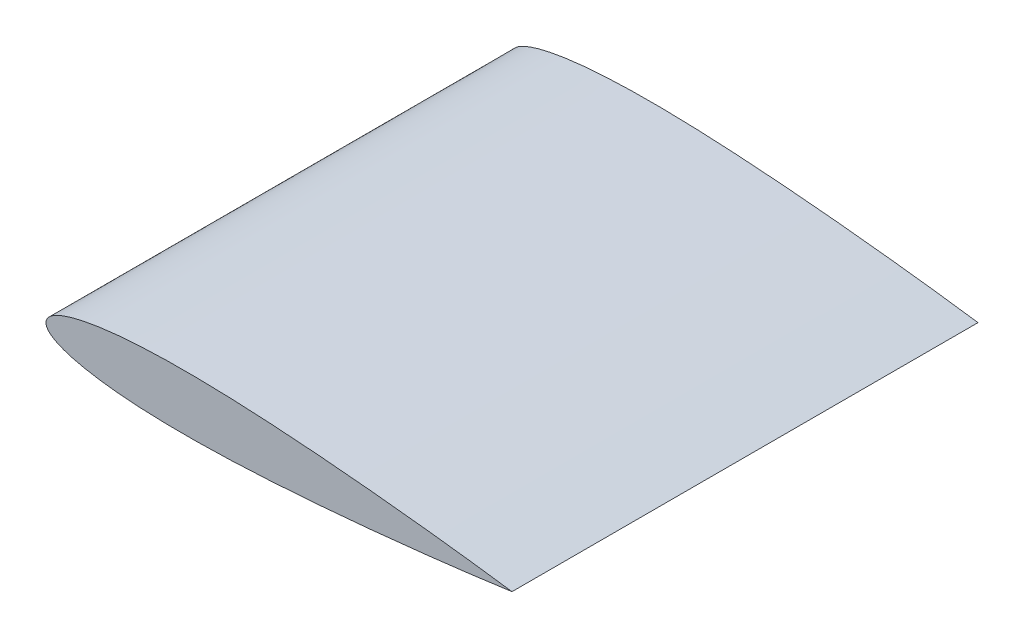
ISO-10303-21;
HEADER;
FILE_DESCRIPTION(('STEP AP214'),'2;1');
FILE_NAME('part.step','',(''),(''),'','','');
FILE_SCHEMA(('AUTOMOTIVE_DESIGN { 1 0 10303 214 1 1 1 1 }'));
ENDSEC;
DATA;
#1=APPLICATION_CONTEXT('core data for automotive mechanical design processes');
#2=APPLICATION_PROTOCOL_DEFINITION('international standard','automotive_design',2000,#1);
#3=PRODUCT_CONTEXT('',#1,'mechanical');
#4=PRODUCT('Part','Part','',(#3));
#5=PRODUCT_RELATED_PRODUCT_CATEGORY('part','',(#4));
#6=PRODUCT_DEFINITION_FORMATION('','',#4);
#7=PRODUCT_DEFINITION_CONTEXT('part definition',#1,'design');
#8=PRODUCT_DEFINITION('design','',#6,#7);
#9=PRODUCT_DEFINITION_SHAPE('','',#8);
#10=(LENGTH_UNIT() NAMED_UNIT(*) SI_UNIT(.MILLI.,.METRE.));
#11=(NAMED_UNIT(*) PLANE_ANGLE_UNIT() SI_UNIT($,.RADIAN.));
#12=(NAMED_UNIT(*) SI_UNIT($,.STERADIAN.) SOLID_ANGLE_UNIT());
#13=UNCERTAINTY_MEASURE_WITH_UNIT(LENGTH_MEASURE(1.E-05),#10,'distance_accuracy_value','');
#14=(GEOMETRIC_REPRESENTATION_CONTEXT(3) GLOBAL_UNCERTAINTY_ASSIGNED_CONTEXT((#13)) GLOBAL_UNIT_ASSIGNED_CONTEXT((#10,
#11,#12)) REPRESENTATION_CONTEXT('',''));
#15=CARTESIAN_POINT('',(0.,0.,0.));
#16=DIRECTION('',(0.,0.,1.));
#17=DIRECTION('',(1.,0.,0.));
#18=AXIS2_PLACEMENT_3D('',#15,#16,#17);
#19=CARTESIAN_POINT('',(-500.000000000175,-5.01398781967765E-12,500.));
#20=CARTESIAN_POINT('',(-500.000054805404,0.888465615342522,500.));
#21=CARTESIAN_POINT('',(-499.852217937138,2.84384249919903,500.));
#22=CARTESIAN_POINT('',(-499.052910864295,6.04124673524626,500.));
#23=CARTESIAN_POINT('',(-497.058121523763,9.71348707139495,500.));
#24=CARTESIAN_POINT('',(-493.225898790342,14.4570848003491,500.));
#25=CARTESIAN_POINT('',(-487.443051485538,19.2161855183269,500.));
#26=CARTESIAN_POINT('',(-478.889571338985,24.4284753026496,500.));
#27=CARTESIAN_POINT('',(-465.133806747581,30.5915797684441,500.));
#28=CARTESIAN_POINT('',(-444.568795838807,37.455367570888,500.));
#29=CARTESIAN_POINT('',(-410.171651616512,45.5097696992029,500.));
#30=CARTESIAN_POINT('',(-360.244659497314,52.90237280471,500.));
#31=CARTESIAN_POINT('',(-296.571173957892,57.9269750461577,500.));
#32=CARTESIAN_POINT('',(-223.436779826628,60.0011177744517,500.));
#33=CARTESIAN_POINT('',(-146.65973679017,59.2334051600726,500.));
#34=CARTESIAN_POINT('',(-70.7421954489174,56.4931308908965,500.));
#35=CARTESIAN_POINT('',(6.37865242503355,51.9965804855477,500.));
#36=CARTESIAN_POINT('',(81.3386668460198,46.5686114294072,500.));
#37=CARTESIAN_POINT('',(159.622585611978,39.6685790430355,500.));
#38=CARTESIAN_POINT('',(232.235267595599,32.719991414768,500.));
#39=CARTESIAN_POINT('',(313.983542126098,23.6950926610696,500.));
#40=CARTESIAN_POINT('',(380.399060908258,16.0710419591503,500.));
#41=CARTESIAN_POINT('',(449.075664558131,7.05430082370455,500.));
#42=CARTESIAN_POINT('',(482.784205437116,2.44252325686824,500.));
#43=CARTESIAN_POINT('',(499.999999999439,4.97288988396564E-11,500.));
#44=B_SPLINE_CURVE_WITH_KNOTS('',4,(#19,#20,#21,#22,#23,#24,#25,#26,#27,#28,#29,#30,#31,#32,#33,
#34,#35,#36,#37,#38,#39,#40,#41,#42,#43),.UNSPECIFIED.,.F.,.F.,(5,1,1,1,1,1,1,1,1,1,1,1,1,1,1,1,
1,1,1,1,1,5),(0.,0.00315885096935919,0.00700071141599614,0.0116257023804154,0.0147786430704528,
0.0248424699389437,0.0335426498104388,0.0473103576745305,0.0684408233242907,0.102185963673142,
0.159338810757229,0.227557949363413,0.295777086022294,0.363996223426424,0.432215362049018,
0.50043450047875,0.568653638657986,0.636872776866897,0.705091914824336,0.773311052073013,
0.841530189666697,0.909749329976357),.UNSPECIFIED.);
#45=DIRECTION('',(0.,0.,-1.));
#46=VECTOR('',#45,1.);
#47=SURFACE_OF_LINEAR_EXTRUSION('',#44,#46);
#48=CARTESIAN_POINT('',(-500.000000000175,-5.01398781967765E-12,-500.));
#49=CARTESIAN_POINT('',(-500.000054805404,0.888465615342522,-500.));
#50=CARTESIAN_POINT('',(-499.852217937138,2.84384249919903,-500.));
#51=CARTESIAN_POINT('',(-499.052910864295,6.04124673524626,-500.));
#52=CARTESIAN_POINT('',(-497.058121523763,9.71348707139495,-500.));
#53=CARTESIAN_POINT('',(-493.225898790342,14.4570848003491,-500.));
#54=CARTESIAN_POINT('',(-487.443051485538,19.2161855183269,-500.));
#55=CARTESIAN_POINT('',(-478.889571338985,24.4284753026496,-500.));
#56=CARTESIAN_POINT('',(-465.133806747581,30.5915797684441,-500.));
#57=CARTESIAN_POINT('',(-444.568795838807,37.455367570888,-500.));
#58=CARTESIAN_POINT('',(-410.171651616512,45.5097696992029,-500.));
#59=CARTESIAN_POINT('',(-360.244659497314,52.90237280471,-500.));
#60=CARTESIAN_POINT('',(-296.571173957892,57.9269750461577,-500.));
#61=CARTESIAN_POINT('',(-223.436779826628,60.0011177744517,-500.));
#62=CARTESIAN_POINT('',(-146.65973679017,59.2334051600726,-500.));
#63=CARTESIAN_POINT('',(-70.7421954489174,56.4931308908965,-500.));
#64=CARTESIAN_POINT('',(6.37865242503355,51.9965804855477,-500.));
#65=CARTESIAN_POINT('',(81.3386668460198,46.5686114294072,-500.));
#66=CARTESIAN_POINT('',(159.622585611978,39.6685790430355,-500.));
#67=CARTESIAN_POINT('',(232.235267595599,32.719991414768,-500.));
#68=CARTESIAN_POINT('',(313.983542126098,23.6950926610696,-500.));
#69=CARTESIAN_POINT('',(380.399060908258,16.0710419591503,-500.));
#70=CARTESIAN_POINT('',(449.075664558131,7.05430082370455,-500.));
#71=CARTESIAN_POINT('',(482.784205437116,2.44252325686824,-500.));
#72=CARTESIAN_POINT('',(499.999999999439,4.97288988396564E-11,-500.));
#73=B_SPLINE_CURVE_WITH_KNOTS('',4,(#48,#49,#50,#51,#52,#53,#54,#55,#56,#57,#58,#59,#60,#61,#62,
#63,#64,#65,#66,#67,#68,#69,#70,#71,#72),.UNSPECIFIED.,.F.,.F.,(5,1,1,1,1,1,1,1,1,1,1,1,1,1,1,1,
1,1,1,1,1,5),(0.,0.00315885096935919,0.00700071141599614,0.0116257023804154,0.0147786430704528,
0.0248424699389437,0.0335426498104388,0.0473103576745305,0.0684408233242907,0.102185963673142,
0.159338810757229,0.227557949363413,0.295777086022294,0.363996223426424,0.432215362049018,
0.50043450047875,0.568653638657986,0.636872776866897,0.705091914824336,0.773311052073013,
0.841530189666697,0.909749329976357),.UNSPECIFIED.);
#74=CARTESIAN_POINT('',(-500.000000000181,-2.58506380747527E-12,-500.));
#75=VERTEX_POINT('',#74);
#76=CARTESIAN_POINT('',(499.99999999962,2.41421330626421E-11,-500.));
#77=VERTEX_POINT('',#76);
#78=EDGE_CURVE('E72',#75,#77,#73,.T.);
#79=ORIENTED_EDGE('',*,*,#78,.F.);
#80=DIRECTION('',(0.,0.,-1.));
#81=VECTOR('',#80,1.);
#82=CARTESIAN_POINT('',(-500.000000000181,-2.58506380747527E-12,500.));
#83=LINE('',#82,#81);
#84=CARTESIAN_POINT('',(-500.000000000181,-2.58506380747527E-12,500.));
#85=VERTEX_POINT('',#84);
#86=EDGE_CURVE('E53',#85,#75,#83,.T.);
#87=ORIENTED_EDGE('',*,*,#86,.F.);
#88=CARTESIAN_POINT('',(499.99999999962,2.41421330626421E-11,500.));
#89=VERTEX_POINT('',#88);
#90=EDGE_CURVE('E73',#85,#89,#44,.T.);
#91=ORIENTED_EDGE('',*,*,#90,.T.);
#92=DIRECTION('',(0.,0.,-1.));
#93=VECTOR('',#92,1.);
#94=CARTESIAN_POINT('',(499.99999999962,2.41421330626421E-11,500.));
#95=LINE('',#94,#93);
#96=EDGE_CURVE('E11',#89,#77,#95,.T.);
#97=ORIENTED_EDGE('',*,*,#96,.T.);
#98=EDGE_LOOP('',(#79,#87,#91,#97));
#99=FACE_BOUND('',#98,.T.);
#100=ADVANCED_FACE('F44',(#99),#47,.T.);
#101=CARTESIAN_POINT('',(-500.000000000181,-2.58506380747527E-12,500.));
#102=CARTESIAN_POINT('',(-500.00005480541,-0.888465615350121,500.));
#103=CARTESIAN_POINT('',(-499.852217937144,-2.84384249920662,500.));
#104=CARTESIAN_POINT('',(-499.052910864301,-6.04124673525381,500.));
#105=CARTESIAN_POINT('',(-497.058121523768,-9.71348707140239,500.));
#106=CARTESIAN_POINT('',(-493.225898790347,-14.4570848003563,500.));
#107=CARTESIAN_POINT('',(-487.443051485543,-19.2161855183338,500.));
#108=CARTESIAN_POINT('',(-478.889571338989,-24.428475302656,500.));
#109=CARTESIAN_POINT('',(-465.133806747585,-30.5915797684498,500.));
#110=CARTESIAN_POINT('',(-444.568795838811,-37.4553675708926,500.));
#111=CARTESIAN_POINT('',(-410.171651616516,-45.5097696992056,500.));
#112=CARTESIAN_POINT('',(-360.244659497317,-52.9023728047099,500.));
#113=CARTESIAN_POINT('',(-296.571173957895,-57.926975046154,500.));
#114=CARTESIAN_POINT('',(-223.43677982663,-60.001117774444,500.));
#115=CARTESIAN_POINT('',(-146.659736790173,-59.2334051600607,500.));
#116=CARTESIAN_POINT('',(-70.7421954489202,-56.4931308908805,500.));
#117=CARTESIAN_POINT('',(6.37865242503044,-51.9965804855275,500.));
#118=CARTESIAN_POINT('',(81.3386668460163,-46.5686114293828,500.));
#119=CARTESIAN_POINT('',(159.622585611974,-39.6685790430068,500.));
#120=CARTESIAN_POINT('',(232.235267595595,-32.7199914147353,500.));
#121=CARTESIAN_POINT('',(313.983542126094,-23.6950926610324,500.));
#122=CARTESIAN_POINT('',(380.399060908298,-16.0710419591043,500.));
#123=CARTESIAN_POINT('',(449.07566455825,-7.05430082364365,500.));
#124=CARTESIAN_POINT('',(482.784205437247,-2.44252325680304,500.));
#125=CARTESIAN_POINT('',(499.99999999962,2.41421330626421E-11,500.));
#126=B_SPLINE_CURVE_WITH_KNOTS('',4,(#101,#102,#103,#104,#105,#106,#107,#108,#109,#110,#111,
#112,#113,#114,#115,#116,#117,#118,#119,#120,#121,#122,#123,#124,#125),.UNSPECIFIED.,.F.,.F.,(5,
1,1,1,1,1,1,1,1,1,1,1,1,1,1,1,1,1,1,1,1,5),(0.,0.00315885096935919,0.00700071141599614,
0.0116257023804154,0.0147786430704528,0.0248424699389437,0.0335426498104388,0.0473103576745305,
0.0684408233242907,0.102185963673142,0.159338810757229,0.227557949363413,0.295777086022294,
0.363996223426424,0.432215362049018,0.50043450047875,0.568653638657986,0.636872776866897,
0.705091914824336,0.773311052073013,0.841530189666697,0.909749329976357),.UNSPECIFIED.);
#127=DIRECTION('',(0.,0.,-1.));
#128=VECTOR('',#127,1.);
#129=SURFACE_OF_LINEAR_EXTRUSION('',#126,#128);
#130=CARTESIAN_POINT('',(-500.000000000181,-2.58506380747527E-12,-500.));
#131=CARTESIAN_POINT('',(-500.00005480541,-0.888465615350121,-500.));
#132=CARTESIAN_POINT('',(-499.852217937144,-2.84384249920662,-500.));
#133=CARTESIAN_POINT('',(-499.052910864301,-6.04124673525381,-500.));
#134=CARTESIAN_POINT('',(-497.058121523768,-9.71348707140239,-500.));
#135=CARTESIAN_POINT('',(-493.225898790347,-14.4570848003563,-500.));
#136=CARTESIAN_POINT('',(-487.443051485543,-19.2161855183338,-500.));
#137=CARTESIAN_POINT('',(-478.889571338989,-24.428475302656,-500.));
#138=CARTESIAN_POINT('',(-465.133806747585,-30.5915797684498,-500.));
#139=CARTESIAN_POINT('',(-444.568795838811,-37.4553675708926,-500.));
#140=CARTESIAN_POINT('',(-410.171651616516,-45.5097696992056,-500.));
#141=CARTESIAN_POINT('',(-360.244659497317,-52.9023728047099,-500.));
#142=CARTESIAN_POINT('',(-296.571173957895,-57.926975046154,-500.));
#143=CARTESIAN_POINT('',(-223.43677982663,-60.001117774444,-500.));
#144=CARTESIAN_POINT('',(-146.659736790173,-59.2334051600607,-500.));
#145=CARTESIAN_POINT('',(-70.7421954489202,-56.4931308908805,-500.));
#146=CARTESIAN_POINT('',(6.37865242503044,-51.9965804855275,-500.));
#147=CARTESIAN_POINT('',(81.3386668460163,-46.5686114293828,-500.));
#148=CARTESIAN_POINT('',(159.622585611974,-39.6685790430068,-500.));
#149=CARTESIAN_POINT('',(232.235267595595,-32.7199914147353,-500.));
#150=CARTESIAN_POINT('',(313.983542126094,-23.6950926610324,-500.));
#151=CARTESIAN_POINT('',(380.399060908298,-16.0710419591043,-500.));
#152=CARTESIAN_POINT('',(449.07566455825,-7.05430082364365,-500.));
#153=CARTESIAN_POINT('',(482.784205437247,-2.44252325680304,-500.));
#154=CARTESIAN_POINT('',(499.99999999962,2.41421330626421E-11,-500.));
#155=B_SPLINE_CURVE_WITH_KNOTS('',4,(#130,#131,#132,#133,#134,#135,#136,#137,#138,#139,#140,
#141,#142,#143,#144,#145,#146,#147,#148,#149,#150,#151,#152,#153,#154),.UNSPECIFIED.,.F.,.F.,(5,
1,1,1,1,1,1,1,1,1,1,1,1,1,1,1,1,1,1,1,1,5),(0.,0.00315885096935919,0.00700071141599614,
0.0116257023804154,0.0147786430704528,0.0248424699389437,0.0335426498104388,0.0473103576745305,
0.0684408233242907,0.102185963673142,0.159338810757229,0.227557949363413,0.295777086022294,
0.363996223426424,0.432215362049018,0.50043450047875,0.568653638657986,0.636872776866897,
0.705091914824336,0.773311052073013,0.841530189666697,0.909749329976357),.UNSPECIFIED.);
#156=EDGE_CURVE('E66',#75,#77,#155,.T.);
#157=ORIENTED_EDGE('',*,*,#156,.T.);
#158=ORIENTED_EDGE('',*,*,#96,.F.);
#159=EDGE_CURVE('E65',#85,#89,#126,.T.);
#160=ORIENTED_EDGE('',*,*,#159,.F.);
#161=ORIENTED_EDGE('',*,*,#86,.T.);
#162=EDGE_LOOP('',(#157,#158,#160,#161));
#163=FACE_BOUND('',#162,.T.);
#164=ADVANCED_FACE('F76',(#163),#129,.F.);
#165=CARTESIAN_POINT('',(-6.8343263559163,52.6151959504198,500.));
#166=DIRECTION('',(0.,0.,-1.));
#167=DIRECTION('',(1.,0.,0.));
#168=AXIS2_PLACEMENT_3D('',#165,#166,#167);
#169=PLANE('',#168);
#170=ORIENTED_EDGE('',*,*,#90,.F.);
#171=ORIENTED_EDGE('',*,*,#159,.T.);
#172=EDGE_LOOP('',(#170,#171));
#173=FACE_BOUND('',#172,.T.);
#174=ADVANCED_FACE('F105',(#173),#169,.F.);
#175=CARTESIAN_POINT('',(-6.8343263559163,52.6151959504198,-500.));
#176=DIRECTION('',(0.,0.,-1.));
#177=DIRECTION('',(1.,0.,0.));
#178=AXIS2_PLACEMENT_3D('',#175,#176,#177);
#179=PLANE('',#178);
#180=ORIENTED_EDGE('',*,*,#78,.T.);
#181=ORIENTED_EDGE('',*,*,#156,.F.);
#182=EDGE_LOOP('',(#180,#181));
#183=FACE_BOUND('',#182,.T.);
#184=ADVANCED_FACE('F71',(#183),#179,.T.);
#185=CLOSED_SHELL('',(#100,#164,#174,#184));
#186=MANIFOLD_SOLID_BREP('B2',#185);
#187=ADVANCED_BREP_SHAPE_REPRESENTATION('',(#18,#186),#14);
#188=SHAPE_DEFINITION_REPRESENTATION(#9,#187);
ENDSEC;
END-ISO-10303-21;
